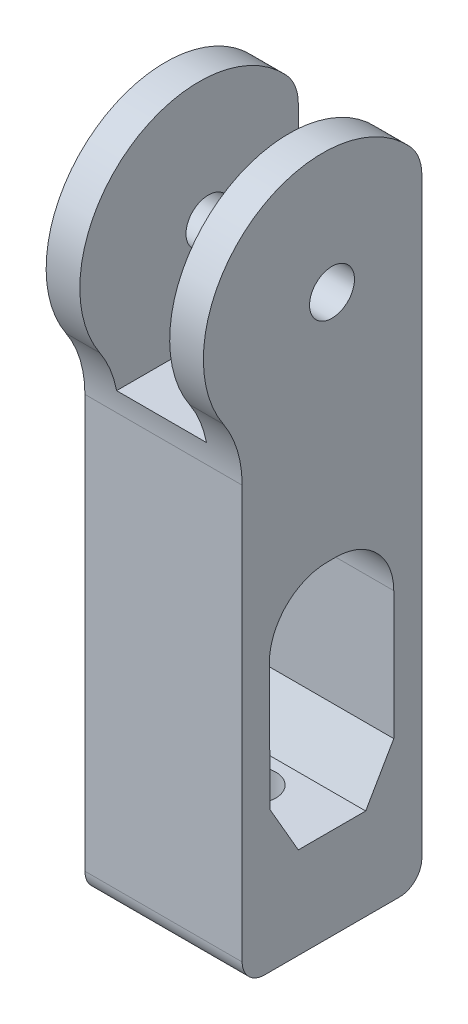
ISO-10303-21;
HEADER;
FILE_DESCRIPTION(('STEP AP214'),'2;1');
FILE_NAME('part.step','',(''),(''),'','','');
FILE_SCHEMA(('AUTOMOTIVE_DESIGN { 1 0 10303 214 1 1 1 1 }'));
ENDSEC;
DATA;
#1=APPLICATION_CONTEXT('core data for automotive mechanical design processes');
#2=APPLICATION_PROTOCOL_DEFINITION('international standard','automotive_design',2000,#1);
#3=PRODUCT_CONTEXT('',#1,'mechanical');
#4=PRODUCT('Part','Part','',(#3));
#5=PRODUCT_RELATED_PRODUCT_CATEGORY('part','',(#4));
#6=PRODUCT_DEFINITION_FORMATION('','',#4);
#7=PRODUCT_DEFINITION_CONTEXT('part definition',#1,'design');
#8=PRODUCT_DEFINITION('design','',#6,#7);
#9=PRODUCT_DEFINITION_SHAPE('','',#8);
#10=(LENGTH_UNIT() NAMED_UNIT(*) SI_UNIT(.MILLI.,.METRE.));
#11=(NAMED_UNIT(*) PLANE_ANGLE_UNIT() SI_UNIT($,.RADIAN.));
#12=(NAMED_UNIT(*) SI_UNIT($,.STERADIAN.) SOLID_ANGLE_UNIT());
#13=UNCERTAINTY_MEASURE_WITH_UNIT(LENGTH_MEASURE(1.E-05),#10,'distance_accuracy_value','');
#14=(GEOMETRIC_REPRESENTATION_CONTEXT(3) GLOBAL_UNCERTAINTY_ASSIGNED_CONTEXT((#13)) GLOBAL_UNIT_ASSIGNED_CONTEXT((#10,
#11,#12)) REPRESENTATION_CONTEXT('',''));
#15=CARTESIAN_POINT('',(0.,0.,0.));
#16=DIRECTION('',(0.,0.,1.));
#17=DIRECTION('',(1.,0.,0.));
#18=AXIS2_PLACEMENT_3D('',#15,#16,#17);
#19=CARTESIAN_POINT('',(14.,5.05388944475506,-4.));
#20=DIRECTION('',(-1.,0.,0.));
#21=DIRECTION('',(0.,0.,1.));
#22=AXIS2_PLACEMENT_3D('',#19,#20,#21);
#23=CYLINDRICAL_SURFACE('',#22,4.);
#24=DIRECTION('',(-1.,0.,0.));
#25=VECTOR('',#24,1.);
#26=CARTESIAN_POINT('',(14.,7.78202542026224,-6.92528188370684));
#27=LINE('',#26,#25);
#28=CARTESIAN_POINT('',(3.,7.78202542026224,-6.92528188370684));
#29=VERTEX_POINT('',#28);
#30=CARTESIAN_POINT('',(0.,7.78202542026224,-6.92528188370684));
#31=VERTEX_POINT('',#30);
#32=EDGE_CURVE('E315',#29,#31,#27,.T.);
#33=ORIENTED_EDGE('',*,*,#32,.F.);
#34=CARTESIAN_POINT('',(3.,5.05388944475506,-4.));
#35=DIRECTION('',(-1.,0.,0.));
#36=DIRECTION('',(0.,0.,1.));
#37=AXIS2_PLACEMENT_3D('',#34,#35,#36);
#38=CIRCLE('',#37,4.);
#39=CARTESIAN_POINT('',(3.,5.05388944475506,-8.));
#40=VERTEX_POINT('',#39);
#41=EDGE_CURVE('E222',#29,#40,#38,.T.);
#42=ORIENTED_EDGE('',*,*,#41,.T.);
#43=DIRECTION('',(-1.,0.,0.));
#44=VECTOR('',#43,1.);
#45=CARTESIAN_POINT('',(14.,5.05388944475506,-8.));
#46=LINE('',#45,#44);
#47=CARTESIAN_POINT('',(0.,5.05388944475506,-8.));
#48=VERTEX_POINT('',#47);
#49=EDGE_CURVE('E319',#40,#48,#46,.T.);
#50=ORIENTED_EDGE('',*,*,#49,.T.);
#51=CARTESIAN_POINT('',(0.,5.05388944475506,-4.));
#52=DIRECTION('',(1.,0.,0.));
#53=DIRECTION('',(0.,0.,-1.));
#54=AXIS2_PLACEMENT_3D('',#51,#52,#53);
#55=CIRCLE('',#54,4.);
#56=EDGE_CURVE('E301',#48,#31,#55,.T.);
#57=ORIENTED_EDGE('',*,*,#56,.T.);
#58=EDGE_LOOP('',(#33,#42,#50,#57));
#59=FACE_BOUND('',#58,.T.);
#60=ADVANCED_FACE('F35',(#59),#23,.T.);
#61=CARTESIAN_POINT('',(14.,0.542746798317087,0.837135676856788));
#62=DIRECTION('',(-1.,0.,0.));
#63=DIRECTION('',(0.,0.,1.));
#64=AXIS2_PLACEMENT_3D('',#61,#62,#63);
#65=CYLINDRICAL_SURFACE('',#64,10.6142489772333);
#66=DIRECTION('',(-1.,0.,0.));
#67=VECTOR('',#66,1.);
#68=CARTESIAN_POINT('',(14.,-5.33665065206196,9.67427135371358));
#69=LINE('',#68,#67);
#70=CARTESIAN_POINT('',(3.,-5.33665065206196,9.67427135371358));
#71=VERTEX_POINT('',#70);
#72=CARTESIAN_POINT('',(0.,-5.33665065206196,9.67427135371358));
#73=VERTEX_POINT('',#72);
#74=EDGE_CURVE('E313',#71,#73,#69,.T.);
#75=ORIENTED_EDGE('',*,*,#74,.F.);
#76=CARTESIAN_POINT('',(3.,0.542746798317087,0.837135676856788));
#77=DIRECTION('',(-1.,0.,0.));
#78=DIRECTION('',(0.,0.,1.));
#79=AXIS2_PLACEMENT_3D('',#76,#77,#78);
#80=CIRCLE('',#79,10.6142489772333);
#81=EDGE_CURVE('E219',#71,#29,#80,.T.);
#82=ORIENTED_EDGE('',*,*,#81,.T.);
#83=ORIENTED_EDGE('',*,*,#32,.T.);
#84=CARTESIAN_POINT('',(0.,0.542746798317087,0.837135676856788));
#85=DIRECTION('',(1.,0.,0.));
#86=DIRECTION('',(0.,0.,-1.));
#87=AXIS2_PLACEMENT_3D('',#84,#85,#86);
#88=CIRCLE('',#87,10.6142489772333);
#89=EDGE_CURVE('E304',#31,#73,#88,.T.);
#90=ORIENTED_EDGE('',*,*,#89,.T.);
#91=EDGE_LOOP('',(#75,#82,#83,#90));
#92=FACE_BOUND('',#91,.T.);
#93=ADVANCED_FACE('F399',(#92),#65,.T.);
#94=CARTESIAN_POINT('',(14.,0.,0.));
#95=DIRECTION('',(-1.,0.,0.));
#96=DIRECTION('',(0.,0.,1.));
#97=AXIS2_PLACEMENT_3D('',#94,#95,#96);
#98=CYLINDRICAL_SURFACE('',#97,2.);
#99=CARTESIAN_POINT('',(3.,0.,0.));
#100=DIRECTION('',(-1.,0.,0.));
#101=DIRECTION('',(0.,0.,1.));
#102=AXIS2_PLACEMENT_3D('',#99,#100,#101);
#103=CIRCLE('',#102,2.);
#104=CARTESIAN_POINT('',(3.,0.,2.));
#105=VERTEX_POINT('',#104);
#106=EDGE_CURVE('E216',#105,#105,#103,.T.);
#107=ORIENTED_EDGE('',*,*,#106,.F.);
#108=EDGE_LOOP('',(#107));
#109=FACE_BOUND('',#108,.T.);
#110=CARTESIAN_POINT('',(0.,0.,0.));
#111=DIRECTION('',(1.,0.,0.));
#112=DIRECTION('',(0.,0.,-1.));
#113=AXIS2_PLACEMENT_3D('',#110,#111,#112);
#114=CIRCLE('',#113,2.);
#115=CARTESIAN_POINT('',(0.,0.,-2.));
#116=VERTEX_POINT('',#115);
#117=EDGE_CURVE('E274',#116,#116,#114,.T.);
#118=ORIENTED_EDGE('',*,*,#117,.F.);
#119=EDGE_LOOP('',(#118));
#120=FACE_BOUND('',#119,.T.);
#121=ADVANCED_FACE('F406',(#109,#120),#98,.F.);
#122=CARTESIAN_POINT('',(14.,-10.8758060487272,18.));
#123=DIRECTION('',(1.,0.,0.));
#124=DIRECTION('',(0.,0.,-1.));
#125=AXIS2_PLACEMENT_3D('',#122,#123,#124);
#126=PLANE('',#125);
#127=CARTESIAN_POINT('',(14.,0.,0.));
#128=DIRECTION('',(1.,0.,0.));
#129=DIRECTION('',(0.,0.,-1.));
#130=AXIS2_PLACEMENT_3D('',#127,#128,#129);
#131=CIRCLE('',#130,2.);
#132=CARTESIAN_POINT('',(14.,0.,-2.));
#133=VERTEX_POINT('',#132);
#134=EDGE_CURVE('E275',#133,#133,#131,.T.);
#135=ORIENTED_EDGE('',*,*,#134,.F.);
#136=EDGE_LOOP('',(#135));
#137=FACE_BOUND('',#136,.T.);
#138=DIRECTION('',(0.,0.,-1.));
#139=VECTOR('',#138,1.);
#140=CARTESIAN_POINT('',(14.,-49.6420148220989,-8.));
#141=LINE('',#140,#139);
#142=CARTESIAN_POINT('',(14.,-49.6420148220989,6.));
#143=VERTEX_POINT('',#142);
#144=CARTESIAN_POINT('',(14.,-49.6420148220989,-6.));
#145=VERTEX_POINT('',#144);
#146=EDGE_CURVE('E281',#143,#145,#141,.T.);
#147=ORIENTED_EDGE('',*,*,#146,.T.);
#148=CARTESIAN_POINT('',(14.,-47.6420148220989,-6.));
#149=DIRECTION('',(1.,0.,0.));
#150=DIRECTION('',(0.,0.,-1.));
#151=AXIS2_PLACEMENT_3D('',#148,#149,#150);
#152=CIRCLE('',#151,2.);
#153=CARTESIAN_POINT('',(14.,-47.6420148220989,-8.));
#154=VERTEX_POINT('',#153);
#155=EDGE_CURVE('E339',#145,#154,#152,.T.);
#156=ORIENTED_EDGE('',*,*,#155,.T.);
#157=DIRECTION('',(0.,1.,0.));
#158=VECTOR('',#157,1.);
#159=CARTESIAN_POINT('',(14.,5.05388944475506,-8.));
#160=LINE('',#159,#158);
#161=CARTESIAN_POINT('',(14.,5.05388944475506,-8.));
#162=VERTEX_POINT('',#161);
#163=EDGE_CURVE('E284',#154,#162,#160,.T.);
#164=ORIENTED_EDGE('',*,*,#163,.T.);
#165=CARTESIAN_POINT('',(14.,5.05388944475506,-4.));
#166=DIRECTION('',(1.,0.,0.));
#167=DIRECTION('',(0.,0.,-1.));
#168=AXIS2_PLACEMENT_3D('',#165,#166,#167);
#169=CIRCLE('',#168,4.);
#170=CARTESIAN_POINT('',(14.,7.78202542026224,-6.92528188370684));
#171=VERTEX_POINT('',#170);
#172=EDGE_CURVE('E287',#162,#171,#169,.T.);
#173=ORIENTED_EDGE('',*,*,#172,.T.);
#174=CARTESIAN_POINT('',(14.,0.542746798317087,0.837135676856788));
#175=DIRECTION('',(1.,0.,0.));
#176=DIRECTION('',(0.,0.,-1.));
#177=AXIS2_PLACEMENT_3D('',#174,#175,#176);
#178=CIRCLE('',#177,10.6142489772333);
#179=CARTESIAN_POINT('',(14.,-5.33665065206196,9.67427135371358));
#180=VERTEX_POINT('',#179);
#181=EDGE_CURVE('E289',#171,#180,#178,.T.);
#182=ORIENTED_EDGE('',*,*,#181,.T.);
#183=CARTESIAN_POINT('',(14.,-10.8758060487272,18.));
#184=DIRECTION('',(-1.,0.,0.));
#185=DIRECTION('',(0.,0.,-1.));
#186=AXIS2_PLACEMENT_3D('',#183,#184,#185);
#187=CIRCLE('',#186,10.);
#188=CARTESIAN_POINT('',(14.,-10.8758060487272,8.));
#189=VERTEX_POINT('',#188);
#190=EDGE_CURVE('E291',#180,#189,#187,.T.);
#191=ORIENTED_EDGE('',*,*,#190,.T.);
#192=DIRECTION('',(0.,-1.,0.));
#193=VECTOR('',#192,1.);
#194=CARTESIAN_POINT('',(14.,-49.6420148220989,8.));
#195=LINE('',#194,#193);
#196=CARTESIAN_POINT('',(14.,-47.6420148220989,8.));
#197=VERTEX_POINT('',#196);
#198=EDGE_CURVE('E293',#189,#197,#195,.T.);
#199=ORIENTED_EDGE('',*,*,#198,.T.);
#200=CARTESIAN_POINT('',(14.,-47.6420148220989,6.));
#201=DIRECTION('',(1.,0.,0.));
#202=DIRECTION('',(0.,0.,-1.));
#203=AXIS2_PLACEMENT_3D('',#200,#201,#202);
#204=CIRCLE('',#203,2.);
#205=EDGE_CURVE('E337',#197,#143,#204,.T.);
#206=ORIENTED_EDGE('',*,*,#205,.T.);
#207=EDGE_LOOP('',(#147,#156,#164,#173,#182,#191,#199,#206));
#208=FACE_BOUND('',#207,.T.);
#209=DIRECTION('',(0.,1.,0.));
#210=VECTOR('',#209,1.);
#211=CARTESIAN_POINT('',(14.,-41.5,-5.5));
#212=LINE('',#211,#210);
#213=CARTESIAN_POINT('',(14.,-37.1698729810778,-5.5));
#214=VERTEX_POINT('',#213);
#215=CARTESIAN_POINT('',(14.,-25.7623645236089,-5.5));
#216=VERTEX_POINT('',#215);
#217=EDGE_CURVE('E237',#214,#216,#212,.T.);
#218=ORIENTED_EDGE('',*,*,#217,.F.);
#219=DIRECTION('',(0.,0.866025403784441,-0.499999999999996));
#220=VECTOR('',#219,1.);
#221=CARTESIAN_POINT('',(14.,-41.5,-3.));
#222=LINE('',#221,#220);
#223=CARTESIAN_POINT('',(14.,-41.5,-3.));
#224=VERTEX_POINT('',#223);
#225=EDGE_CURVE('E354',#214,#224,#222,.F.);
#226=ORIENTED_EDGE('',*,*,#225,.T.);
#227=DIRECTION('',(0.,0.,-1.));
#228=VECTOR('',#227,1.);
#229=CARTESIAN_POINT('',(14.,-41.5,5.5));
#230=LINE('',#229,#228);
#231=CARTESIAN_POINT('',(14.,-41.5,3.));
#232=VERTEX_POINT('',#231);
#233=EDGE_CURVE('E234',#232,#224,#230,.T.);
#234=ORIENTED_EDGE('',*,*,#233,.F.);
#235=DIRECTION('',(0.,-0.866025403784441,-0.499999999999996));
#236=VECTOR('',#235,1.);
#237=CARTESIAN_POINT('',(14.,-37.1342017545076,5.52059479226262));
#238=LINE('',#237,#236);
#239=CARTESIAN_POINT('',(14.,-37.1342017545076,5.52059479226262));
#240=VERTEX_POINT('',#239);
#241=EDGE_CURVE('E11',#232,#240,#238,.F.);
#242=ORIENTED_EDGE('',*,*,#241,.T.);
#243=DIRECTION('',(0.,-0.999988873712868,-0.00471725030819026));
#244=VECTOR('',#243,1.);
#245=CARTESIAN_POINT('',(14.,-25.7867233016974,5.57412428407582));
#246=LINE('',#245,#244);
#247=CARTESIAN_POINT('',(14.,-25.7867233016974,5.57412428407581));
#248=VERTEX_POINT('',#247);
#249=EDGE_CURVE('E247',#248,#240,#246,.T.);
#250=ORIENTED_EDGE('',*,*,#249,.F.);
#251=CARTESIAN_POINT('',(14.,-25.7623645236089,0.410415454935214));
#252=DIRECTION('',(1.,0.,0.));
#253=DIRECTION('',(0.,0.,1.));
#254=AXIS2_PLACEMENT_3D('',#251,#252,#253);
#255=CIRCLE('',#254,5.16376628268695);
#256=CARTESIAN_POINT('',(14.,-20.5985982409219,0.410415454935179));
#257=VERTEX_POINT('',#256);
#258=EDGE_CURVE('E244',#257,#248,#255,.T.);
#259=ORIENTED_EDGE('',*,*,#258,.F.);
#260=DIRECTION('',(0.,0.,1.));
#261=VECTOR('',#260,1.);
#262=CARTESIAN_POINT('',(14.,-20.5985982409219,-0.336233717313019));
#263=LINE('',#262,#261);
#264=CARTESIAN_POINT('',(14.,-20.5985982409219,-0.336233717313018));
#265=VERTEX_POINT('',#264);
#266=EDGE_CURVE('E242',#265,#257,#263,.T.);
#267=ORIENTED_EDGE('',*,*,#266,.F.);
#268=CARTESIAN_POINT('',(14.,-25.7623645236089,-0.336233717313054));
#269=DIRECTION('',(1.,0.,0.));
#270=DIRECTION('',(0.,0.,-1.));
#271=AXIS2_PLACEMENT_3D('',#268,#269,#270);
#272=CIRCLE('',#271,5.16376628268695);
#273=EDGE_CURVE('E240',#216,#265,#272,.T.);
#274=ORIENTED_EDGE('',*,*,#273,.F.);
#275=EDGE_LOOP('',(#218,#226,#234,#242,#250,#259,#267,#274));
#276=FACE_BOUND('',#275,.T.);
#277=ADVANCED_FACE('F366',(#137,#208,#276),#126,.T.);
#278=CARTESIAN_POINT('',(0.,-10.8758060487272,18.));
#279=DIRECTION('',(1.,0.,0.));
#280=DIRECTION('',(0.,0.,-1.));
#281=AXIS2_PLACEMENT_3D('',#278,#279,#280);
#282=PLANE('',#281);
#283=ORIENTED_EDGE('',*,*,#117,.T.);
#284=EDGE_LOOP('',(#283));
#285=FACE_BOUND('',#284,.T.);
#286=DIRECTION('',(0.,1.,0.));
#287=VECTOR('',#286,1.);
#288=CARTESIAN_POINT('',(0.,5.05388944475506,-8.));
#289=LINE('',#288,#287);
#290=CARTESIAN_POINT('',(0.,-47.6420148220989,-8.));
#291=VERTEX_POINT('',#290);
#292=EDGE_CURVE('E299',#291,#48,#289,.T.);
#293=ORIENTED_EDGE('',*,*,#292,.F.);
#294=CARTESIAN_POINT('',(0.,-47.6420148220989,-6.));
#295=DIRECTION('',(1.,0.,0.));
#296=DIRECTION('',(0.,0.,-1.));
#297=AXIS2_PLACEMENT_3D('',#294,#295,#296);
#298=CIRCLE('',#297,2.);
#299=CARTESIAN_POINT('',(0.,-49.6420148220989,-6.));
#300=VERTEX_POINT('',#299);
#301=EDGE_CURVE('E330',#291,#300,#298,.F.);
#302=ORIENTED_EDGE('',*,*,#301,.T.);
#303=DIRECTION('',(0.,0.,-1.));
#304=VECTOR('',#303,1.);
#305=CARTESIAN_POINT('',(0.,-49.6420148220989,-8.));
#306=LINE('',#305,#304);
#307=CARTESIAN_POINT('',(0.,-49.6420148220989,6.));
#308=VERTEX_POINT('',#307);
#309=EDGE_CURVE('E278',#308,#300,#306,.T.);
#310=ORIENTED_EDGE('',*,*,#309,.F.);
#311=CARTESIAN_POINT('',(0.,-47.6420148220989,6.));
#312=DIRECTION('',(1.,0.,0.));
#313=DIRECTION('',(0.,0.,-1.));
#314=AXIS2_PLACEMENT_3D('',#311,#312,#313);
#315=CIRCLE('',#314,2.);
#316=CARTESIAN_POINT('',(0.,-47.6420148220989,8.));
#317=VERTEX_POINT('',#316);
#318=EDGE_CURVE('E328',#308,#317,#315,.F.);
#319=ORIENTED_EDGE('',*,*,#318,.T.);
#320=DIRECTION('',(0.,-1.,0.));
#321=VECTOR('',#320,1.);
#322=CARTESIAN_POINT('',(0.,-49.6420148220989,8.));
#323=LINE('',#322,#321);
#324=CARTESIAN_POINT('',(0.,-10.8758060487272,8.));
#325=VERTEX_POINT('',#324);
#326=EDGE_CURVE('E285',#325,#317,#323,.T.);
#327=ORIENTED_EDGE('',*,*,#326,.F.);
#328=CARTESIAN_POINT('',(0.,-10.8758060487272,18.));
#329=DIRECTION('',(-1.,0.,0.));
#330=DIRECTION('',(0.,0.,-1.));
#331=AXIS2_PLACEMENT_3D('',#328,#329,#330);
#332=CIRCLE('',#331,10.);
#333=EDGE_CURVE('E307',#73,#325,#332,.T.);
#334=ORIENTED_EDGE('',*,*,#333,.F.);
#335=ORIENTED_EDGE('',*,*,#89,.F.);
#336=ORIENTED_EDGE('',*,*,#56,.F.);
#337=EDGE_LOOP('',(#293,#302,#310,#319,#327,#334,#335,#336));
#338=FACE_BOUND('',#337,.T.);
#339=DIRECTION('',(0.,-0.999988873712868,-0.00471725030819026));
#340=VECTOR('',#339,1.);
#341=CARTESIAN_POINT('',(0.,-25.7867233016974,5.57412428407582));
#342=LINE('',#341,#340);
#343=CARTESIAN_POINT('',(0.,-25.7867233016974,5.57412428407582));
#344=VERTEX_POINT('',#343);
#345=CARTESIAN_POINT('',(0.,-37.1342017545076,5.52059479226262));
#346=VERTEX_POINT('',#345);
#347=EDGE_CURVE('E238',#344,#346,#342,.T.);
#348=ORIENTED_EDGE('',*,*,#347,.T.);
#349=DIRECTION('',(0.,0.866025403784441,0.499999999999996));
#350=VECTOR('',#349,1.);
#351=CARTESIAN_POINT('',(0.,-12.036664008162,20.0106649661119));
#352=LINE('',#351,#350);
#353=CARTESIAN_POINT('',(0.,-41.5,3.));
#354=VERTEX_POINT('',#353);
#355=EDGE_CURVE('E43',#346,#354,#352,.F.);
#356=ORIENTED_EDGE('',*,*,#355,.T.);
#357=DIRECTION('',(0.,0.,-1.));
#358=VECTOR('',#357,1.);
#359=CARTESIAN_POINT('',(0.,-41.5,5.5));
#360=LINE('',#359,#358);
#361=CARTESIAN_POINT('',(0.,-41.5,-3.));
#362=VERTEX_POINT('',#361);
#363=EDGE_CURVE('E250',#354,#362,#360,.T.);
#364=ORIENTED_EDGE('',*,*,#363,.T.);
#365=DIRECTION('',(0.,-0.866025403784441,0.499999999999996));
#366=VECTOR('',#365,1.);
#367=CARTESIAN_POINT('',(0.,-27.6251212762818,-11.010664966112));
#368=LINE('',#367,#366);
#369=CARTESIAN_POINT('',(0.,-37.1698729810778,-5.5));
#370=VERTEX_POINT('',#369);
#371=EDGE_CURVE('E352',#362,#370,#368,.F.);
#372=ORIENTED_EDGE('',*,*,#371,.T.);
#373=DIRECTION('',(0.,1.,0.));
#374=VECTOR('',#373,1.);
#375=CARTESIAN_POINT('',(0.,-41.5,-5.5));
#376=LINE('',#375,#374);
#377=CARTESIAN_POINT('',(0.,-25.7623645236089,-5.5));
#378=VERTEX_POINT('',#377);
#379=EDGE_CURVE('E253',#370,#378,#376,.T.);
#380=ORIENTED_EDGE('',*,*,#379,.T.);
#381=CARTESIAN_POINT('',(0.,-25.7623645236089,-0.336233717313054));
#382=DIRECTION('',(1.,0.,0.));
#383=DIRECTION('',(0.,0.,-1.));
#384=AXIS2_PLACEMENT_3D('',#381,#382,#383);
#385=CIRCLE('',#384,5.16376628268695);
#386=CARTESIAN_POINT('',(0.,-20.5985982409219,-0.336233717313018));
#387=VERTEX_POINT('',#386);
#388=EDGE_CURVE('E255',#378,#387,#385,.T.);
#389=ORIENTED_EDGE('',*,*,#388,.T.);
#390=DIRECTION('',(0.,0.,1.));
#391=VECTOR('',#390,1.);
#392=CARTESIAN_POINT('',(0.,-20.5985982409219,-0.336233717313019));
#393=LINE('',#392,#391);
#394=CARTESIAN_POINT('',(0.,-20.5985982409219,0.410415454935179));
#395=VERTEX_POINT('',#394);
#396=EDGE_CURVE('E258',#387,#395,#393,.T.);
#397=ORIENTED_EDGE('',*,*,#396,.T.);
#398=CARTESIAN_POINT('',(0.,-25.7623645236089,0.410415454935214));
#399=DIRECTION('',(1.,0.,0.));
#400=DIRECTION('',(0.,0.,1.));
#401=AXIS2_PLACEMENT_3D('',#398,#399,#400);
#402=CIRCLE('',#401,5.16376628268695);
#403=EDGE_CURVE('E261',#395,#344,#402,.T.);
#404=ORIENTED_EDGE('',*,*,#403,.T.);
#405=EDGE_LOOP('',(#348,#356,#364,#372,#380,#389,#397,#404));
#406=FACE_BOUND('',#405,.T.);
#407=ADVANCED_FACE('F357',(#285,#338,#406),#282,.F.);
#408=CARTESIAN_POINT('',(14.,-49.6420148220989,-8.));
#409=DIRECTION('',(0.,1.,0.));
#410=DIRECTION('',(0.,0.,1.));
#411=AXIS2_PLACEMENT_3D('',#408,#409,#410);
#412=PLANE('',#411);
#413=CARTESIAN_POINT('',(7.,-49.6420148220989,0.));
#414=DIRECTION('',(0.,-1.,0.));
#415=DIRECTION('',(0.,0.,-1.));
#416=AXIS2_PLACEMENT_3D('',#413,#414,#415);
#417=CIRCLE('',#416,2.);
#418=CARTESIAN_POINT('',(7.,-49.6420148220989,-2.));
#419=VERTEX_POINT('',#418);
#420=EDGE_CURVE('E230',#419,#419,#417,.T.);
#421=ORIENTED_EDGE('',*,*,#420,.F.);
#422=EDGE_LOOP('',(#421));
#423=FACE_BOUND('',#422,.T.);
#424=ORIENTED_EDGE('',*,*,#309,.T.);
#425=DIRECTION('',(-1.,0.,0.));
#426=VECTOR('',#425,1.);
#427=CARTESIAN_POINT('',(14.,-49.6420148220989,-6.));
#428=LINE('',#427,#426);
#429=EDGE_CURVE('E335',#300,#145,#428,.F.);
#430=ORIENTED_EDGE('',*,*,#429,.T.);
#431=ORIENTED_EDGE('',*,*,#146,.F.);
#432=DIRECTION('',(-1.,0.,0.));
#433=VECTOR('',#432,1.);
#434=CARTESIAN_POINT('',(14.,-49.6420148220989,6.));
#435=LINE('',#434,#433);
#436=EDGE_CURVE('E332',#143,#308,#435,.T.);
#437=ORIENTED_EDGE('',*,*,#436,.T.);
#438=EDGE_LOOP('',(#424,#430,#431,#437));
#439=FACE_BOUND('',#438,.T.);
#440=ADVANCED_FACE('F420',(#423,#439),#412,.F.);
#441=CARTESIAN_POINT('',(14.,5.05388944475506,-8.));
#442=DIRECTION('',(0.,0.,1.));
#443=DIRECTION('',(1.,0.,0.));
#444=AXIS2_PLACEMENT_3D('',#441,#442,#443);
#445=PLANE('',#444);
#446=ORIENTED_EDGE('',*,*,#163,.F.);
#447=DIRECTION('',(-1.,0.,0.));
#448=VECTOR('',#447,1.);
#449=CARTESIAN_POINT('',(14.,-47.6420148220989,-8.));
#450=LINE('',#449,#448);
#451=EDGE_CURVE('E189',#154,#291,#450,.T.);
#452=ORIENTED_EDGE('',*,*,#451,.T.);
#453=ORIENTED_EDGE('',*,*,#292,.T.);
#454=ORIENTED_EDGE('',*,*,#49,.F.);
#455=DIRECTION('',(0.,-1.,0.));
#456=VECTOR('',#455,1.);
#457=CARTESIAN_POINT('',(3.,5.05388944475506,-8.));
#458=LINE('',#457,#456);
#459=CARTESIAN_POINT('',(3.,-9.,-8.));
#460=VERTEX_POINT('',#459);
#461=EDGE_CURVE('E225',#40,#460,#458,.T.);
#462=ORIENTED_EDGE('',*,*,#461,.T.);
#463=DIRECTION('',(-1.,0.,0.));
#464=VECTOR('',#463,1.);
#465=CARTESIAN_POINT('',(14.,-9.,-8.));
#466=LINE('',#465,#464);
#467=CARTESIAN_POINT('',(11.,-9.,-8.));
#468=VERTEX_POINT('',#467);
#469=EDGE_CURVE('E228',#468,#460,#466,.T.);
#470=ORIENTED_EDGE('',*,*,#469,.F.);
#471=DIRECTION('',(0.,1.,0.));
#472=VECTOR('',#471,1.);
#473=CARTESIAN_POINT('',(11.,5.05388944475506,-8.));
#474=LINE('',#473,#472);
#475=CARTESIAN_POINT('',(11.,5.05388944475506,-8.));
#476=VERTEX_POINT('',#475);
#477=EDGE_CURVE('E197',#468,#476,#474,.T.);
#478=ORIENTED_EDGE('',*,*,#477,.T.);
#479=EDGE_CURVE('E190',#162,#476,#46,.T.);
#480=ORIENTED_EDGE('',*,*,#479,.F.);
#481=EDGE_LOOP('',(#446,#452,#453,#454,#462,#470,#478,#480));
#482=FACE_BOUND('',#481,.T.);
#483=ADVANCED_FACE('F413',(#482),#445,.F.);
#484=ORIENTED_EDGE('',*,*,#479,.T.);
#485=CARTESIAN_POINT('',(11.,5.05388944475506,-4.));
#486=DIRECTION('',(1.,0.,0.));
#487=DIRECTION('',(0.,0.,-1.));
#488=AXIS2_PLACEMENT_3D('',#485,#486,#487);
#489=CIRCLE('',#488,4.);
#490=CARTESIAN_POINT('',(11.,7.78202542026224,-6.92528188370684));
#491=VERTEX_POINT('',#490);
#492=EDGE_CURVE('E207',#476,#491,#489,.T.);
#493=ORIENTED_EDGE('',*,*,#492,.T.);
#494=EDGE_CURVE('E316',#171,#491,#27,.T.);
#495=ORIENTED_EDGE('',*,*,#494,.F.);
#496=ORIENTED_EDGE('',*,*,#172,.F.);
#497=EDGE_LOOP('',(#484,#493,#495,#496));
#498=FACE_BOUND('',#497,.T.);
#499=ADVANCED_FACE('F402',(#498),#23,.T.);
#500=ORIENTED_EDGE('',*,*,#494,.T.);
#501=CARTESIAN_POINT('',(11.,0.542746798317087,0.837135676856788));
#502=DIRECTION('',(1.,0.,0.));
#503=DIRECTION('',(0.,0.,-1.));
#504=AXIS2_PLACEMENT_3D('',#501,#502,#503);
#505=CIRCLE('',#504,10.6142489772333);
#506=CARTESIAN_POINT('',(11.,-5.33665065206196,9.67427135371358));
#507=VERTEX_POINT('',#506);
#508=EDGE_CURVE('E205',#491,#507,#505,.T.);
#509=ORIENTED_EDGE('',*,*,#508,.T.);
#510=EDGE_CURVE('E204',#180,#507,#69,.T.);
#511=ORIENTED_EDGE('',*,*,#510,.F.);
#512=ORIENTED_EDGE('',*,*,#181,.F.);
#513=EDGE_LOOP('',(#500,#509,#511,#512));
#514=FACE_BOUND('',#513,.T.);
#515=ADVANCED_FACE('F409',(#514),#65,.T.);
#516=CARTESIAN_POINT('',(14.,-10.8758060487272,18.));
#517=DIRECTION('',(-1.,0.,0.));
#518=DIRECTION('',(0.,0.,1.));
#519=AXIS2_PLACEMENT_3D('',#516,#517,#518);
#520=CYLINDRICAL_SURFACE('',#519,10.);
#521=DIRECTION('',(-1.,0.,0.));
#522=VECTOR('',#521,1.);
#523=CARTESIAN_POINT('',(14.,-9.,8.17750786879631));
#524=LINE('',#523,#522);
#525=CARTESIAN_POINT('',(3.,-9.,8.17750786879631));
#526=VERTEX_POINT('',#525);
#527=CARTESIAN_POINT('',(11.,-9.,8.17750786879631));
#528=VERTEX_POINT('',#527);
#529=EDGE_CURVE('E178',#526,#528,#524,.F.);
#530=ORIENTED_EDGE('',*,*,#529,.F.);
#531=CARTESIAN_POINT('',(3.,-10.8758060487272,18.));
#532=DIRECTION('',(-1.,0.,0.));
#533=DIRECTION('',(0.,0.,1.));
#534=AXIS2_PLACEMENT_3D('',#531,#532,#533);
#535=CIRCLE('',#534,10.);
#536=EDGE_CURVE('E217',#526,#71,#535,.F.);
#537=ORIENTED_EDGE('',*,*,#536,.T.);
#538=ORIENTED_EDGE('',*,*,#74,.T.);
#539=ORIENTED_EDGE('',*,*,#333,.T.);
#540=DIRECTION('',(-1.,0.,0.));
#541=VECTOR('',#540,1.);
#542=CARTESIAN_POINT('',(14.,-10.8758060487272,8.));
#543=LINE('',#542,#541);
#544=EDGE_CURVE('E296',#189,#325,#543,.T.);
#545=ORIENTED_EDGE('',*,*,#544,.F.);
#546=ORIENTED_EDGE('',*,*,#190,.F.);
#547=ORIENTED_EDGE('',*,*,#510,.T.);
#548=CARTESIAN_POINT('',(11.,-10.8758060487272,18.));
#549=DIRECTION('',(1.,0.,0.));
#550=DIRECTION('',(0.,0.,-1.));
#551=AXIS2_PLACEMENT_3D('',#548,#549,#550);
#552=CIRCLE('',#551,10.);
#553=EDGE_CURVE('E194',#507,#528,#552,.F.);
#554=ORIENTED_EDGE('',*,*,#553,.T.);
#555=EDGE_LOOP('',(#530,#537,#538,#539,#545,#546,#547,#554));
#556=FACE_BOUND('',#555,.T.);
#557=ADVANCED_FACE('F201',(#556),#520,.F.);
#558=CARTESIAN_POINT('',(14.,-49.6420148220989,8.));
#559=DIRECTION('',(0.,0.,-1.));
#560=DIRECTION('',(-1.,0.,0.));
#561=AXIS2_PLACEMENT_3D('',#558,#559,#560);
#562=PLANE('',#561);
#563=ORIENTED_EDGE('',*,*,#326,.T.);
#564=DIRECTION('',(-1.,0.,0.));
#565=VECTOR('',#564,1.);
#566=CARTESIAN_POINT('',(14.,-47.6420148220989,8.));
#567=LINE('',#566,#565);
#568=EDGE_CURVE('E341',#317,#197,#567,.F.);
#569=ORIENTED_EDGE('',*,*,#568,.T.);
#570=ORIENTED_EDGE('',*,*,#198,.F.);
#571=ORIENTED_EDGE('',*,*,#544,.T.);
#572=EDGE_LOOP('',(#563,#569,#570,#571));
#573=FACE_BOUND('',#572,.T.);
#574=ADVANCED_FACE('F440',(#573),#562,.F.);
#575=CARTESIAN_POINT('',(11.,0.,0.));
#576=DIRECTION('',(1.,0.,0.));
#577=DIRECTION('',(0.,0.,-1.));
#578=AXIS2_PLACEMENT_3D('',#575,#576,#577);
#579=CIRCLE('',#578,2.);
#580=CARTESIAN_POINT('',(11.,0.,-2.));
#581=VERTEX_POINT('',#580);
#582=EDGE_CURVE('E198',#581,#581,#579,.T.);
#583=ORIENTED_EDGE('',*,*,#582,.F.);
#584=EDGE_LOOP('',(#583));
#585=FACE_BOUND('',#584,.T.);
#586=ORIENTED_EDGE('',*,*,#134,.T.);
#587=EDGE_LOOP('',(#586));
#588=FACE_BOUND('',#587,.T.);
#589=ADVANCED_FACE('F395',(#585,#588),#98,.F.);
#590=CARTESIAN_POINT('',(14.,-41.5,5.5));
#591=DIRECTION('',(0.,1.,0.));
#592=DIRECTION('',(0.,0.,1.));
#593=AXIS2_PLACEMENT_3D('',#590,#591,#592);
#594=PLANE('',#593);
#595=CARTESIAN_POINT('',(7.,-41.5,0.));
#596=DIRECTION('',(0.,1.,0.));
#597=DIRECTION('',(0.,0.,1.));
#598=AXIS2_PLACEMENT_3D('',#595,#596,#597);
#599=CIRCLE('',#598,2.);
#600=CARTESIAN_POINT('',(7.,-41.5,2.));
#601=VERTEX_POINT('',#600);
#602=EDGE_CURVE('E233',#601,#601,#599,.T.);
#603=ORIENTED_EDGE('',*,*,#602,.F.);
#604=EDGE_LOOP('',(#603));
#605=FACE_BOUND('',#604,.T.);
#606=ORIENTED_EDGE('',*,*,#233,.T.);
#607=DIRECTION('',(-1.,0.,0.));
#608=VECTOR('',#607,1.);
#609=CARTESIAN_POINT('',(0.,-41.5,-3.));
#610=LINE('',#609,#608);
#611=EDGE_CURVE('E345',#224,#362,#610,.T.);
#612=ORIENTED_EDGE('',*,*,#611,.T.);
#613=ORIENTED_EDGE('',*,*,#363,.F.);
#614=DIRECTION('',(1.,0.,0.));
#615=VECTOR('',#614,1.);
#616=CARTESIAN_POINT('',(14.,-41.5,3.));
#617=LINE('',#616,#615);
#618=EDGE_CURVE('E343',#354,#232,#617,.T.);
#619=ORIENTED_EDGE('',*,*,#618,.T.);
#620=EDGE_LOOP('',(#606,#612,#613,#619));
#621=FACE_BOUND('',#620,.T.);
#622=ADVANCED_FACE('F360',(#605,#621),#594,.T.);
#623=CARTESIAN_POINT('',(14.,-41.5,-5.5));
#624=DIRECTION('',(0.,0.,1.));
#625=DIRECTION('',(1.,0.,0.));
#626=AXIS2_PLACEMENT_3D('',#623,#624,#625);
#627=PLANE('',#626);
#628=ORIENTED_EDGE('',*,*,#379,.F.);
#629=DIRECTION('',(1.,0.,0.));
#630=VECTOR('',#629,1.);
#631=CARTESIAN_POINT('',(14.,-37.1698729810778,-5.5));
#632=LINE('',#631,#630);
#633=EDGE_CURVE('E348',#370,#214,#632,.T.);
#634=ORIENTED_EDGE('',*,*,#633,.T.);
#635=ORIENTED_EDGE('',*,*,#217,.T.);
#636=DIRECTION('',(-1.,0.,0.));
#637=VECTOR('',#636,1.);
#638=CARTESIAN_POINT('',(14.,-25.7623645236089,-5.5));
#639=LINE('',#638,#637);
#640=EDGE_CURVE('E271',#216,#378,#639,.T.);
#641=ORIENTED_EDGE('',*,*,#640,.T.);
#642=EDGE_LOOP('',(#628,#634,#635,#641));
#643=FACE_BOUND('',#642,.T.);
#644=ADVANCED_FACE('F387',(#643),#627,.T.);
#645=CARTESIAN_POINT('',(14.,-25.7623645236089,-0.336233717313054));
#646=DIRECTION('',(-1.,0.,0.));
#647=DIRECTION('',(0.,0.,1.));
#648=AXIS2_PLACEMENT_3D('',#645,#646,#647);
#649=CYLINDRICAL_SURFACE('',#648,5.16376628268695);
#650=ORIENTED_EDGE('',*,*,#388,.F.);
#651=ORIENTED_EDGE('',*,*,#640,.F.);
#652=ORIENTED_EDGE('',*,*,#273,.T.);
#653=DIRECTION('',(-1.,0.,0.));
#654=VECTOR('',#653,1.);
#655=CARTESIAN_POINT('',(14.,-20.5985982409219,-0.336233717313018));
#656=LINE('',#655,#654);
#657=EDGE_CURVE('E269',#265,#387,#656,.T.);
#658=ORIENTED_EDGE('',*,*,#657,.T.);
#659=EDGE_LOOP('',(#650,#651,#652,#658));
#660=FACE_BOUND('',#659,.T.);
#661=ADVANCED_FACE('F379',(#660),#649,.F.);
#662=CARTESIAN_POINT('',(14.,-20.5985982409219,-0.336233717313019));
#663=DIRECTION('',(0.,-1.,0.));
#664=DIRECTION('',(0.,0.,-1.));
#665=AXIS2_PLACEMENT_3D('',#662,#663,#664);
#666=PLANE('',#665);
#667=ORIENTED_EDGE('',*,*,#396,.F.);
#668=ORIENTED_EDGE('',*,*,#657,.F.);
#669=ORIENTED_EDGE('',*,*,#266,.T.);
#670=DIRECTION('',(-1.,0.,0.));
#671=VECTOR('',#670,1.);
#672=CARTESIAN_POINT('',(14.,-20.5985982409219,0.410415454935179));
#673=LINE('',#672,#671);
#674=EDGE_CURVE('E267',#257,#395,#673,.T.);
#675=ORIENTED_EDGE('',*,*,#674,.T.);
#676=EDGE_LOOP('',(#667,#668,#669,#675));
#677=FACE_BOUND('',#676,.T.);
#678=ADVANCED_FACE('F375',(#677),#666,.T.);
#679=CARTESIAN_POINT('',(14.,-25.7623645236089,0.410415454935214));
#680=DIRECTION('',(-1.,0.,0.));
#681=DIRECTION('',(0.,0.,1.));
#682=AXIS2_PLACEMENT_3D('',#679,#680,#681);
#683=CYLINDRICAL_SURFACE('',#682,5.16376628268695);
#684=ORIENTED_EDGE('',*,*,#403,.F.);
#685=ORIENTED_EDGE('',*,*,#674,.F.);
#686=ORIENTED_EDGE('',*,*,#258,.T.);
#687=DIRECTION('',(-1.,0.,0.));
#688=VECTOR('',#687,1.);
#689=CARTESIAN_POINT('',(14.,-25.7867233016974,5.57412428407582));
#690=LINE('',#689,#688);
#691=EDGE_CURVE('E249',#248,#344,#690,.T.);
#692=ORIENTED_EDGE('',*,*,#691,.T.);
#693=EDGE_LOOP('',(#684,#685,#686,#692));
#694=FACE_BOUND('',#693,.T.);
#695=ADVANCED_FACE('F372',(#694),#683,.F.);
#696=CARTESIAN_POINT('',(14.,-25.7867233016974,5.57412428407582));
#697=DIRECTION('',(0.,0.00471725030819026,-0.999988873712868));
#698=DIRECTION('',(0.,0.999988873712868,0.00471725030819026));
#699=AXIS2_PLACEMENT_3D('',#696,#697,#698);
#700=PLANE('',#699);
#701=ORIENTED_EDGE('',*,*,#249,.T.);
#702=DIRECTION('',(-1.,0.,0.));
#703=VECTOR('',#702,1.);
#704=CARTESIAN_POINT('',(0.,-37.1342017545076,5.52059479226262));
#705=LINE('',#704,#703);
#706=EDGE_CURVE('E350',#240,#346,#705,.T.);
#707=ORIENTED_EDGE('',*,*,#706,.T.);
#708=ORIENTED_EDGE('',*,*,#347,.F.);
#709=ORIENTED_EDGE('',*,*,#691,.F.);
#710=EDGE_LOOP('',(#701,#707,#708,#709));
#711=FACE_BOUND('',#710,.T.);
#712=ADVANCED_FACE('F363',(#711),#700,.T.);
#713=CARTESIAN_POINT('',(7.,-35.6420148220989,0.));
#714=DIRECTION('',(0.,-1.,0.));
#715=DIRECTION('',(0.,0.,-1.));
#716=AXIS2_PLACEMENT_3D('',#713,#714,#715);
#717=CYLINDRICAL_SURFACE('',#716,2.);
#718=ORIENTED_EDGE('',*,*,#602,.T.);
#719=EDGE_LOOP('',(#718));
#720=FACE_BOUND('',#719,.T.);
#721=ORIENTED_EDGE('',*,*,#420,.T.);
#722=EDGE_LOOP('',(#721));
#723=FACE_BOUND('',#722,.T.);
#724=ADVANCED_FACE('F485',(#720,#723),#717,.F.);
#725=CARTESIAN_POINT('',(0.,-9.,0.));
#726=DIRECTION('',(0.,1.,0.));
#727=DIRECTION('',(0.,0.,1.));
#728=AXIS2_PLACEMENT_3D('',#725,#726,#727);
#729=PLANE('',#728);
#730=ORIENTED_EDGE('',*,*,#469,.T.);
#731=DIRECTION('',(0.,0.,1.));
#732=VECTOR('',#731,1.);
#733=CARTESIAN_POINT('',(3.,-9.,16.0587196500795));
#734=LINE('',#733,#732);
#735=EDGE_CURVE('E184',#460,#526,#734,.T.);
#736=ORIENTED_EDGE('',*,*,#735,.T.);
#737=ORIENTED_EDGE('',*,*,#529,.T.);
#738=DIRECTION('',(0.,0.,-1.));
#739=VECTOR('',#738,1.);
#740=CARTESIAN_POINT('',(11.,-9.,16.0587196500795));
#741=LINE('',#740,#739);
#742=EDGE_CURVE('E181',#528,#468,#741,.T.);
#743=ORIENTED_EDGE('',*,*,#742,.T.);
#744=EDGE_LOOP('',(#730,#736,#737,#743));
#745=FACE_BOUND('',#744,.T.);
#746=ADVANCED_FACE('F180',(#745),#729,.T.);
#747=CARTESIAN_POINT('',(3.,-9.,16.0587196500795));
#748=DIRECTION('',(-1.,0.,0.));
#749=DIRECTION('',(0.,0.,1.));
#750=AXIS2_PLACEMENT_3D('',#747,#748,#749);
#751=PLANE('',#750);
#752=ORIENTED_EDGE('',*,*,#106,.T.);
#753=EDGE_LOOP('',(#752));
#754=FACE_BOUND('',#753,.T.);
#755=ORIENTED_EDGE('',*,*,#41,.F.);
#756=ORIENTED_EDGE('',*,*,#81,.F.);
#757=ORIENTED_EDGE('',*,*,#536,.F.);
#758=ORIENTED_EDGE('',*,*,#735,.F.);
#759=ORIENTED_EDGE('',*,*,#461,.F.);
#760=EDGE_LOOP('',(#755,#756,#757,#758,#759));
#761=FACE_BOUND('',#760,.T.);
#762=ADVANCED_FACE('F429',(#754,#761),#751,.F.);
#763=CARTESIAN_POINT('',(11.,-9.,16.0587196500795));
#764=DIRECTION('',(1.,0.,0.));
#765=DIRECTION('',(0.,0.,-1.));
#766=AXIS2_PLACEMENT_3D('',#763,#764,#765);
#767=PLANE('',#766);
#768=ORIENTED_EDGE('',*,*,#582,.T.);
#769=EDGE_LOOP('',(#768));
#770=FACE_BOUND('',#769,.T.);
#771=ORIENTED_EDGE('',*,*,#742,.F.);
#772=ORIENTED_EDGE('',*,*,#553,.F.);
#773=ORIENTED_EDGE('',*,*,#508,.F.);
#774=ORIENTED_EDGE('',*,*,#492,.F.);
#775=ORIENTED_EDGE('',*,*,#477,.F.);
#776=EDGE_LOOP('',(#771,#772,#773,#774,#775));
#777=FACE_BOUND('',#776,.T.);
#778=ADVANCED_FACE('F193',(#770,#777),#767,.F.);
#779=CARTESIAN_POINT('',(14.,-47.6420148220989,-6.));
#780=DIRECTION('',(-1.,0.,0.));
#781=DIRECTION('',(0.,0.,1.));
#782=AXIS2_PLACEMENT_3D('',#779,#780,#781);
#783=CYLINDRICAL_SURFACE('',#782,2.);
#784=ORIENTED_EDGE('',*,*,#155,.F.);
#785=ORIENTED_EDGE('',*,*,#429,.F.);
#786=ORIENTED_EDGE('',*,*,#301,.F.);
#787=ORIENTED_EDGE('',*,*,#451,.F.);
#788=EDGE_LOOP('',(#784,#785,#786,#787));
#789=FACE_BOUND('',#788,.T.);
#790=ADVANCED_FACE('F453',(#789),#783,.T.);
#791=CARTESIAN_POINT('',(14.,-47.6420148220989,6.));
#792=DIRECTION('',(-1.,0.,0.));
#793=DIRECTION('',(0.,0.,1.));
#794=AXIS2_PLACEMENT_3D('',#791,#792,#793);
#795=CYLINDRICAL_SURFACE('',#794,2.);
#796=ORIENTED_EDGE('',*,*,#205,.F.);
#797=ORIENTED_EDGE('',*,*,#568,.F.);
#798=ORIENTED_EDGE('',*,*,#318,.F.);
#799=ORIENTED_EDGE('',*,*,#436,.F.);
#800=EDGE_LOOP('',(#796,#797,#798,#799));
#801=FACE_BOUND('',#800,.T.);
#802=ADVANCED_FACE('F447',(#801),#795,.T.);
#803=CARTESIAN_POINT('',(14.,-41.5,-3.));
#804=DIRECTION('',(0.,0.499999999999996,0.866025403784441));
#805=DIRECTION('',(1.,0.,0.));
#806=AXIS2_PLACEMENT_3D('',#803,#804,#805);
#807=PLANE('',#806);
#808=ORIENTED_EDGE('',*,*,#225,.F.);
#809=ORIENTED_EDGE('',*,*,#633,.F.);
#810=ORIENTED_EDGE('',*,*,#371,.F.);
#811=ORIENTED_EDGE('',*,*,#611,.F.);
#812=EDGE_LOOP('',(#808,#809,#810,#811));
#813=FACE_BOUND('',#812,.T.);
#814=ADVANCED_FACE('F385',(#813),#807,.T.);
#815=CARTESIAN_POINT('',(14.,-37.1342017545076,5.52059479226262));
#816=DIRECTION('',(0.,0.499999999999996,-0.866025403784441));
#817=DIRECTION('',(1.,0.,0.));
#818=AXIS2_PLACEMENT_3D('',#815,#816,#817);
#819=PLANE('',#818);
#820=ORIENTED_EDGE('',*,*,#241,.F.);
#821=ORIENTED_EDGE('',*,*,#618,.F.);
#822=ORIENTED_EDGE('',*,*,#355,.F.);
#823=ORIENTED_EDGE('',*,*,#706,.F.);
#824=EDGE_LOOP('',(#820,#821,#822,#823));
#825=FACE_BOUND('',#824,.T.);
#826=ADVANCED_FACE('F37',(#825),#819,.T.);
#827=CLOSED_SHELL('',(#60,#93,#121,#277,#407,#440,#483,#499,#515,#557,#574,#589,#622,#644,#661,
#678,#695,#712,#724,#746,#762,#778,#790,#802,#814,#826));
#828=MANIFOLD_SOLID_BREP('B2',#827);
#829=ADVANCED_BREP_SHAPE_REPRESENTATION('',(#18,#828),#14);
#830=SHAPE_DEFINITION_REPRESENTATION(#9,#829);
ENDSEC;
END-ISO-10303-21;
